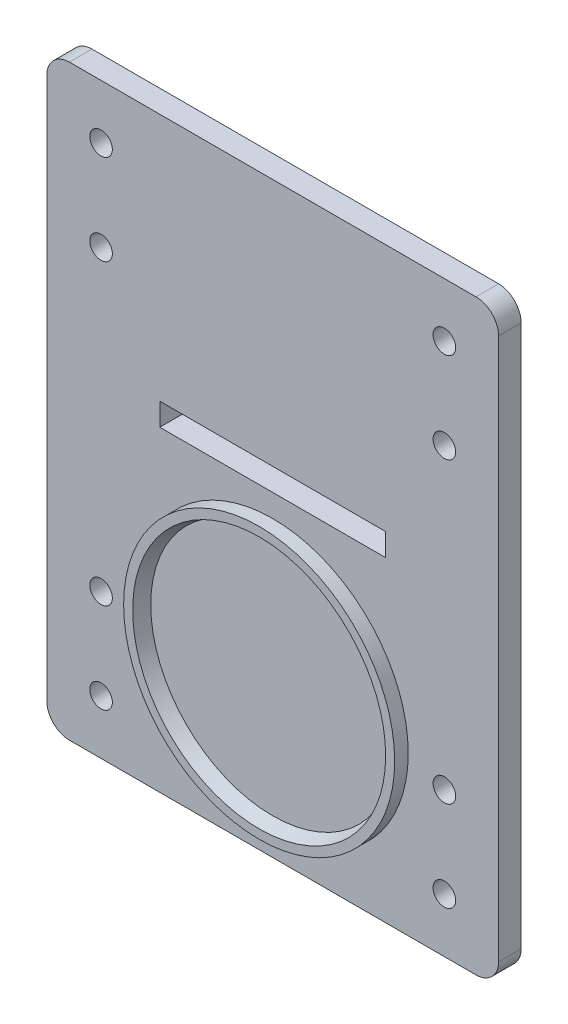
ISO-10303-21;
HEADER;
FILE_DESCRIPTION(('STEP AP214'),'2;1');
FILE_NAME('part.step','',(''),(''),'','','');
FILE_SCHEMA(('AUTOMOTIVE_DESIGN { 1 0 10303 214 1 1 1 1 }'));
ENDSEC;
DATA;
#1=APPLICATION_CONTEXT('core data for automotive mechanical design processes');
#2=APPLICATION_PROTOCOL_DEFINITION('international standard','automotive_design',2000,#1);
#3=PRODUCT_CONTEXT('',#1,'mechanical');
#4=PRODUCT('Part','Part','',(#3));
#5=PRODUCT_RELATED_PRODUCT_CATEGORY('part','',(#4));
#6=PRODUCT_DEFINITION_FORMATION('','',#4);
#7=PRODUCT_DEFINITION_CONTEXT('part definition',#1,'design');
#8=PRODUCT_DEFINITION('design','',#6,#7);
#9=PRODUCT_DEFINITION_SHAPE('','',#8);
#10=(LENGTH_UNIT() NAMED_UNIT(*) SI_UNIT(.MILLI.,.METRE.));
#11=(NAMED_UNIT(*) PLANE_ANGLE_UNIT() SI_UNIT($,.RADIAN.));
#12=(NAMED_UNIT(*) SI_UNIT($,.STERADIAN.) SOLID_ANGLE_UNIT());
#13=UNCERTAINTY_MEASURE_WITH_UNIT(LENGTH_MEASURE(1.E-05),#10,'distance_accuracy_value','');
#14=(GEOMETRIC_REPRESENTATION_CONTEXT(3) GLOBAL_UNCERTAINTY_ASSIGNED_CONTEXT((#13)) GLOBAL_UNIT_ASSIGNED_CONTEXT((#10,
#11,#12)) REPRESENTATION_CONTEXT('',''));
#15=CARTESIAN_POINT('',(0.,0.,0.));
#16=DIRECTION('',(0.,0.,1.));
#17=DIRECTION('',(1.,0.,0.));
#18=AXIS2_PLACEMENT_3D('',#15,#16,#17);
#19=CARTESIAN_POINT('',(50.,-65.,5.));
#20=DIRECTION('',(-1.,0.,0.));
#21=DIRECTION('',(0.,0.,1.));
#22=AXIS2_PLACEMENT_3D('',#19,#20,#21);
#23=PLANE('',#22);
#24=DIRECTION('',(0.,1.,0.));
#25=VECTOR('',#24,1.);
#26=CARTESIAN_POINT('',(50.,-65.,5.));
#27=LINE('',#26,#25);
#28=CARTESIAN_POINT('',(50.,-60.,5.));
#29=VERTEX_POINT('',#28);
#30=CARTESIAN_POINT('',(50.,60.,5.));
#31=VERTEX_POINT('',#30);
#32=EDGE_CURVE('E223',#29,#31,#27,.T.);
#33=ORIENTED_EDGE('',*,*,#32,.F.);
#34=DIRECTION('',(0.,0.,-1.));
#35=VECTOR('',#34,1.);
#36=CARTESIAN_POINT('',(50.,-60.,5.));
#37=LINE('',#36,#35);
#38=CARTESIAN_POINT('',(50.,-60.,0.));
#39=VERTEX_POINT('',#38);
#40=EDGE_CURVE('E276',#29,#39,#37,.T.);
#41=ORIENTED_EDGE('',*,*,#40,.T.);
#42=DIRECTION('',(0.,1.,0.));
#43=VECTOR('',#42,1.);
#44=CARTESIAN_POINT('',(50.,-65.,0.));
#45=LINE('',#44,#43);
#46=CARTESIAN_POINT('',(50.,60.,0.));
#47=VERTEX_POINT('',#46);
#48=EDGE_CURVE('E222',#39,#47,#45,.T.);
#49=ORIENTED_EDGE('',*,*,#48,.T.);
#50=DIRECTION('',(0.,0.,-1.));
#51=VECTOR('',#50,1.);
#52=CARTESIAN_POINT('',(50.,60.,5.));
#53=LINE('',#52,#51);
#54=EDGE_CURVE('E274',#47,#31,#53,.F.);
#55=ORIENTED_EDGE('',*,*,#54,.T.);
#56=EDGE_LOOP('',(#33,#41,#49,#55));
#57=FACE_BOUND('',#56,.T.);
#58=ADVANCED_FACE('F35',(#57),#23,.F.);
#59=CARTESIAN_POINT('',(-50.,65.,5.));
#60=DIRECTION('',(0.,-1.,0.));
#61=DIRECTION('',(0.,0.,-1.));
#62=AXIS2_PLACEMENT_3D('',#59,#60,#61);
#63=PLANE('',#62);
#64=DIRECTION('',(-1.,0.,0.));
#65=VECTOR('',#64,1.);
#66=CARTESIAN_POINT('',(-50.,65.,5.));
#67=LINE('',#66,#65);
#68=CARTESIAN_POINT('',(45.,65.,5.));
#69=VERTEX_POINT('',#68);
#70=CARTESIAN_POINT('',(-45.,65.,5.));
#71=VERTEX_POINT('',#70);
#72=EDGE_CURVE('E225',#69,#71,#67,.T.);
#73=ORIENTED_EDGE('',*,*,#72,.F.);
#74=DIRECTION('',(0.,0.,-1.));
#75=VECTOR('',#74,1.);
#76=CARTESIAN_POINT('',(45.,65.,5.));
#77=LINE('',#76,#75);
#78=CARTESIAN_POINT('',(45.,65.,0.));
#79=VERTEX_POINT('',#78);
#80=EDGE_CURVE('E11',#69,#79,#77,.T.);
#81=ORIENTED_EDGE('',*,*,#80,.T.);
#82=DIRECTION('',(-1.,0.,0.));
#83=VECTOR('',#82,1.);
#84=CARTESIAN_POINT('',(-50.,65.,0.));
#85=LINE('',#84,#83);
#86=CARTESIAN_POINT('',(-45.,65.,0.));
#87=VERTEX_POINT('',#86);
#88=EDGE_CURVE('E237',#79,#87,#85,.T.);
#89=ORIENTED_EDGE('',*,*,#88,.T.);
#90=DIRECTION('',(0.,0.,-1.));
#91=VECTOR('',#90,1.);
#92=CARTESIAN_POINT('',(-45.,65.,5.));
#93=LINE('',#92,#91);
#94=EDGE_CURVE('E43',#87,#71,#93,.F.);
#95=ORIENTED_EDGE('',*,*,#94,.T.);
#96=EDGE_LOOP('',(#73,#81,#89,#95));
#97=FACE_BOUND('',#96,.T.);
#98=ADVANCED_FACE('F291',(#97),#63,.F.);
#99=CARTESIAN_POINT('',(-50.,-65.,5.));
#100=DIRECTION('',(1.,0.,0.));
#101=DIRECTION('',(0.,0.,-1.));
#102=AXIS2_PLACEMENT_3D('',#99,#100,#101);
#103=PLANE('',#102);
#104=DIRECTION('',(0.,-1.,0.));
#105=VECTOR('',#104,1.);
#106=CARTESIAN_POINT('',(-50.,-65.,0.));
#107=LINE('',#106,#105);
#108=CARTESIAN_POINT('',(-50.,60.,0.));
#109=VERTEX_POINT('',#108);
#110=CARTESIAN_POINT('',(-50.,-60.,0.));
#111=VERTEX_POINT('',#110);
#112=EDGE_CURVE('E239',#109,#111,#107,.T.);
#113=ORIENTED_EDGE('',*,*,#112,.T.);
#114=DIRECTION('',(0.,0.,-1.));
#115=VECTOR('',#114,1.);
#116=CARTESIAN_POINT('',(-50.,-60.,5.));
#117=LINE('',#116,#115);
#118=CARTESIAN_POINT('',(-50.,-60.,5.));
#119=VERTEX_POINT('',#118);
#120=EDGE_CURVE('E265',#111,#119,#117,.F.);
#121=ORIENTED_EDGE('',*,*,#120,.T.);
#122=DIRECTION('',(0.,-1.,0.));
#123=VECTOR('',#122,1.);
#124=CARTESIAN_POINT('',(-50.,-65.,5.));
#125=LINE('',#124,#123);
#126=CARTESIAN_POINT('',(-50.,60.,5.));
#127=VERTEX_POINT('',#126);
#128=EDGE_CURVE('E228',#127,#119,#125,.T.);
#129=ORIENTED_EDGE('',*,*,#128,.F.);
#130=DIRECTION('',(0.,0.,-1.));
#131=VECTOR('',#130,1.);
#132=CARTESIAN_POINT('',(-50.,60.,5.));
#133=LINE('',#132,#131);
#134=EDGE_CURVE('E262',#127,#109,#133,.T.);
#135=ORIENTED_EDGE('',*,*,#134,.T.);
#136=EDGE_LOOP('',(#113,#121,#129,#135));
#137=FACE_BOUND('',#136,.T.);
#138=ADVANCED_FACE('F299',(#137),#103,.F.);
#139=CARTESIAN_POINT('',(-50.,-65.,5.));
#140=DIRECTION('',(0.,1.,0.));
#141=DIRECTION('',(0.,0.,1.));
#142=AXIS2_PLACEMENT_3D('',#139,#140,#141);
#143=PLANE('',#142);
#144=DIRECTION('',(1.,0.,0.));
#145=VECTOR('',#144,1.);
#146=CARTESIAN_POINT('',(-50.,-65.,5.));
#147=LINE('',#146,#145);
#148=CARTESIAN_POINT('',(-45.,-65.,5.));
#149=VERTEX_POINT('',#148);
#150=CARTESIAN_POINT('',(45.,-65.,5.));
#151=VERTEX_POINT('',#150);
#152=EDGE_CURVE('E231',#149,#151,#147,.T.);
#153=ORIENTED_EDGE('',*,*,#152,.F.);
#154=DIRECTION('',(0.,0.,-1.));
#155=VECTOR('',#154,1.);
#156=CARTESIAN_POINT('',(-45.,-65.,5.));
#157=LINE('',#156,#155);
#158=CARTESIAN_POINT('',(-45.,-65.,0.));
#159=VERTEX_POINT('',#158);
#160=EDGE_CURVE('E251',#149,#159,#157,.T.);
#161=ORIENTED_EDGE('',*,*,#160,.T.);
#162=DIRECTION('',(1.,0.,0.));
#163=VECTOR('',#162,1.);
#164=CARTESIAN_POINT('',(-50.,-65.,0.));
#165=LINE('',#164,#163);
#166=CARTESIAN_POINT('',(45.,-65.,0.));
#167=VERTEX_POINT('',#166);
#168=EDGE_CURVE('E226',#159,#167,#165,.T.);
#169=ORIENTED_EDGE('',*,*,#168,.T.);
#170=DIRECTION('',(0.,0.,-1.));
#171=VECTOR('',#170,1.);
#172=CARTESIAN_POINT('',(45.,-65.,5.));
#173=LINE('',#172,#171);
#174=EDGE_CURVE('E249',#167,#151,#173,.F.);
#175=ORIENTED_EDGE('',*,*,#174,.T.);
#176=EDGE_LOOP('',(#153,#161,#169,#175));
#177=FACE_BOUND('',#176,.T.);
#178=ADVANCED_FACE('F307',(#177),#143,.F.);
#179=CARTESIAN_POINT('',(0.,0.,5.));
#180=DIRECTION('',(0.,0.,-1.));
#181=DIRECTION('',(-1.,0.,0.));
#182=AXIS2_PLACEMENT_3D('',#179,#180,#181);
#183=PLANE('',#182);
#184=CARTESIAN_POINT('',(-38.,-33.,5.));
#185=DIRECTION('',(0.,0.,1.));
#186=DIRECTION('',(1.,0.,0.));
#187=AXIS2_PLACEMENT_3D('',#184,#185,#186);
#188=CIRCLE('',#187,2.5);
#189=CARTESIAN_POINT('',(-35.5,-33.,5.));
#190=VERTEX_POINT('',#189);
#191=EDGE_CURVE('E191',#190,#190,#188,.T.);
#192=ORIENTED_EDGE('',*,*,#191,.F.);
#193=EDGE_LOOP('',(#192));
#194=FACE_BOUND('',#193,.T.);
#195=CARTESIAN_POINT('',(38.,-53.,5.));
#196=DIRECTION('',(0.,0.,1.));
#197=DIRECTION('',(1.,0.,0.));
#198=AXIS2_PLACEMENT_3D('',#195,#196,#197);
#199=CIRCLE('',#198,2.5);
#200=CARTESIAN_POINT('',(40.5,-53.,5.));
#201=VERTEX_POINT('',#200);
#202=EDGE_CURVE('E197',#201,#201,#199,.T.);
#203=ORIENTED_EDGE('',*,*,#202,.F.);
#204=EDGE_LOOP('',(#203));
#205=FACE_BOUND('',#204,.T.);
#206=CARTESIAN_POINT('',(37.9999999999996,53.,5.));
#207=DIRECTION('',(0.,0.,1.));
#208=DIRECTION('',(1.,0.,0.));
#209=AXIS2_PLACEMENT_3D('',#206,#207,#208);
#210=CIRCLE('',#209,2.5);
#211=CARTESIAN_POINT('',(40.4999999999996,53.,5.));
#212=VERTEX_POINT('',#211);
#213=EDGE_CURVE('E203',#212,#212,#210,.T.);
#214=ORIENTED_EDGE('',*,*,#213,.F.);
#215=EDGE_LOOP('',(#214));
#216=FACE_BOUND('',#215,.T.);
#217=CARTESIAN_POINT('',(-38.0000000000004,53.,5.));
#218=DIRECTION('',(0.,0.,1.));
#219=DIRECTION('',(1.,0.,0.));
#220=AXIS2_PLACEMENT_3D('',#217,#218,#219);
#221=CIRCLE('',#220,2.5);
#222=CARTESIAN_POINT('',(-35.5000000000004,53.,5.));
#223=VERTEX_POINT('',#222);
#224=EDGE_CURVE('E166',#223,#223,#221,.T.);
#225=ORIENTED_EDGE('',*,*,#224,.F.);
#226=EDGE_LOOP('',(#225));
#227=FACE_BOUND('',#226,.T.);
#228=DIRECTION('',(-1.,0.,0.));
#229=VECTOR('',#228,1.);
#230=CARTESIAN_POINT('',(-25.,10.,5.));
#231=LINE('',#230,#229);
#232=CARTESIAN_POINT('',(25.,10.,5.));
#233=VERTEX_POINT('',#232);
#234=CARTESIAN_POINT('',(-25.,10.,5.));
#235=VERTEX_POINT('',#234);
#236=EDGE_CURVE('E159',#233,#235,#231,.T.);
#237=ORIENTED_EDGE('',*,*,#236,.F.);
#238=DIRECTION('',(0.,1.,0.));
#239=VECTOR('',#238,1.);
#240=CARTESIAN_POINT('',(25.,5.00000000000002,5.));
#241=LINE('',#240,#239);
#242=CARTESIAN_POINT('',(25.,5.00000000000002,5.));
#243=VERTEX_POINT('',#242);
#244=EDGE_CURVE('E132',#243,#233,#241,.T.);
#245=ORIENTED_EDGE('',*,*,#244,.F.);
#246=DIRECTION('',(1.,0.,0.));
#247=VECTOR('',#246,1.);
#248=CARTESIAN_POINT('',(-25.,5.00000000000002,5.));
#249=LINE('',#248,#247);
#250=CARTESIAN_POINT('',(-25.,5.00000000000002,5.));
#251=VERTEX_POINT('',#250);
#252=EDGE_CURVE('E150',#251,#243,#249,.T.);
#253=ORIENTED_EDGE('',*,*,#252,.F.);
#254=DIRECTION('',(0.,-1.,0.));
#255=VECTOR('',#254,1.);
#256=CARTESIAN_POINT('',(-25.,5.00000000000002,5.));
#257=LINE('',#256,#255);
#258=EDGE_CURVE('E153',#235,#251,#257,.T.);
#259=ORIENTED_EDGE('',*,*,#258,.F.);
#260=EDGE_LOOP('',(#237,#245,#253,#259));
#261=FACE_BOUND('',#260,.T.);
#262=CARTESIAN_POINT('',(38.,-33.,5.));
#263=DIRECTION('',(0.,0.,1.));
#264=DIRECTION('',(1.,0.,0.));
#265=AXIS2_PLACEMENT_3D('',#262,#263,#264);
#266=CIRCLE('',#265,2.5);
#267=CARTESIAN_POINT('',(40.5,-33.,5.));
#268=VERTEX_POINT('',#267);
#269=EDGE_CURVE('E172',#268,#268,#266,.T.);
#270=ORIENTED_EDGE('',*,*,#269,.F.);
#271=EDGE_LOOP('',(#270));
#272=FACE_BOUND('',#271,.T.);
#273=CARTESIAN_POINT('',(37.9999999999998,33.,5.));
#274=DIRECTION('',(0.,0.,1.));
#275=DIRECTION('',(1.,0.,0.));
#276=AXIS2_PLACEMENT_3D('',#273,#274,#275);
#277=CIRCLE('',#276,2.5);
#278=CARTESIAN_POINT('',(40.4999999999998,33.,5.));
#279=VERTEX_POINT('',#278);
#280=EDGE_CURVE('E178',#279,#279,#277,.T.);
#281=ORIENTED_EDGE('',*,*,#280,.F.);
#282=EDGE_LOOP('',(#281));
#283=FACE_BOUND('',#282,.T.);
#284=CARTESIAN_POINT('',(-38.0000000000002,33.,5.));
#285=DIRECTION('',(0.,0.,1.));
#286=DIRECTION('',(1.,0.,0.));
#287=AXIS2_PLACEMENT_3D('',#284,#285,#286);
#288=CIRCLE('',#287,2.5);
#289=CARTESIAN_POINT('',(-35.5000000000002,33.,5.));
#290=VERTEX_POINT('',#289);
#291=EDGE_CURVE('E184',#290,#290,#288,.T.);
#292=ORIENTED_EDGE('',*,*,#291,.F.);
#293=EDGE_LOOP('',(#292));
#294=FACE_BOUND('',#293,.T.);
#295=CARTESIAN_POINT('',(-38.,-53.,5.));
#296=DIRECTION('',(0.,0.,1.));
#297=DIRECTION('',(1.,0.,0.));
#298=AXIS2_PLACEMENT_3D('',#295,#296,#297);
#299=CIRCLE('',#298,2.5);
#300=CARTESIAN_POINT('',(-35.5,-53.,5.));
#301=VERTEX_POINT('',#300);
#302=EDGE_CURVE('E190',#301,#301,#299,.T.);
#303=ORIENTED_EDGE('',*,*,#302,.F.);
#304=EDGE_LOOP('',(#303));
#305=FACE_BOUND('',#304,.T.);
#306=CARTESIAN_POINT('',(0.,-30.,5.));
#307=DIRECTION('',(0.,0.,-1.));
#308=DIRECTION('',(-1.,0.,0.));
#309=AXIS2_PLACEMENT_3D('',#306,#307,#308);
#310=CIRCLE('',#309,30.);
#311=CARTESIAN_POINT('',(-30.,-30.,5.));
#312=VERTEX_POINT('',#311);
#313=EDGE_CURVE('E234',#312,#312,#310,.F.);
#314=ORIENTED_EDGE('',*,*,#313,.F.);
#315=EDGE_LOOP('',(#314));
#316=FACE_BOUND('',#315,.T.);
#317=ORIENTED_EDGE('',*,*,#128,.T.);
#318=CARTESIAN_POINT('',(-45.,-60.,5.));
#319=DIRECTION('',(0.,0.,-1.));
#320=DIRECTION('',(-1.,0.,0.));
#321=AXIS2_PLACEMENT_3D('',#318,#319,#320);
#322=CIRCLE('',#321,5.);
#323=EDGE_CURVE('E272',#119,#149,#322,.F.);
#324=ORIENTED_EDGE('',*,*,#323,.T.);
#325=ORIENTED_EDGE('',*,*,#152,.T.);
#326=CARTESIAN_POINT('',(45.,-60.,5.));
#327=DIRECTION('',(0.,0.,-1.));
#328=DIRECTION('',(-1.,0.,0.));
#329=AXIS2_PLACEMENT_3D('',#326,#327,#328);
#330=CIRCLE('',#329,5.);
#331=EDGE_CURVE('E270',#151,#29,#330,.F.);
#332=ORIENTED_EDGE('',*,*,#331,.T.);
#333=ORIENTED_EDGE('',*,*,#32,.T.);
#334=CARTESIAN_POINT('',(45.,60.,5.));
#335=DIRECTION('',(0.,0.,-1.));
#336=DIRECTION('',(-1.,0.,0.));
#337=AXIS2_PLACEMENT_3D('',#334,#335,#336);
#338=CIRCLE('',#337,5.);
#339=EDGE_CURVE('E56',#31,#69,#338,.F.);
#340=ORIENTED_EDGE('',*,*,#339,.T.);
#341=ORIENTED_EDGE('',*,*,#72,.T.);
#342=CARTESIAN_POINT('',(-45.,60.,5.));
#343=DIRECTION('',(0.,0.,-1.));
#344=DIRECTION('',(-1.,0.,0.));
#345=AXIS2_PLACEMENT_3D('',#342,#343,#344);
#346=CIRCLE('',#345,5.);
#347=EDGE_CURVE('E267',#71,#127,#346,.F.);
#348=ORIENTED_EDGE('',*,*,#347,.T.);
#349=EDGE_LOOP('',(#317,#324,#325,#332,#333,#340,#341,#348));
#350=FACE_BOUND('',#349,.T.);
#351=ADVANCED_FACE('F293',(#194,#205,#216,#227,#261,#272,#283,#294,#305,#316,#350),#183,.F.);
#352=CARTESIAN_POINT('',(0.,0.,0.));
#353=DIRECTION('',(0.,0.,-1.));
#354=DIRECTION('',(-1.,0.,0.));
#355=AXIS2_PLACEMENT_3D('',#352,#353,#354);
#356=PLANE('',#355);
#357=CARTESIAN_POINT('',(-38.,-33.,0.));
#358=DIRECTION('',(0.,0.,1.));
#359=DIRECTION('',(1.,0.,0.));
#360=AXIS2_PLACEMENT_3D('',#357,#358,#359);
#361=CIRCLE('',#360,2.5);
#362=CARTESIAN_POINT('',(-35.5,-33.,0.));
#363=VERTEX_POINT('',#362);
#364=EDGE_CURVE('E187',#363,#363,#361,.T.);
#365=ORIENTED_EDGE('',*,*,#364,.T.);
#366=EDGE_LOOP('',(#365));
#367=FACE_BOUND('',#366,.T.);
#368=CARTESIAN_POINT('',(38.,-53.,0.));
#369=DIRECTION('',(0.,0.,1.));
#370=DIRECTION('',(1.,0.,0.));
#371=AXIS2_PLACEMENT_3D('',#368,#369,#370);
#372=CIRCLE('',#371,2.5);
#373=CARTESIAN_POINT('',(40.5,-53.,0.));
#374=VERTEX_POINT('',#373);
#375=EDGE_CURVE('E194',#374,#374,#372,.T.);
#376=ORIENTED_EDGE('',*,*,#375,.T.);
#377=EDGE_LOOP('',(#376));
#378=FACE_BOUND('',#377,.T.);
#379=CARTESIAN_POINT('',(37.9999999999996,53.,0.));
#380=DIRECTION('',(0.,0.,1.));
#381=DIRECTION('',(1.,0.,0.));
#382=AXIS2_PLACEMENT_3D('',#379,#380,#381);
#383=CIRCLE('',#382,2.5);
#384=CARTESIAN_POINT('',(40.4999999999996,53.,0.));
#385=VERTEX_POINT('',#384);
#386=EDGE_CURVE('E200',#385,#385,#383,.T.);
#387=ORIENTED_EDGE('',*,*,#386,.T.);
#388=EDGE_LOOP('',(#387));
#389=FACE_BOUND('',#388,.T.);
#390=CARTESIAN_POINT('',(-38.0000000000004,53.,0.));
#391=DIRECTION('',(0.,0.,1.));
#392=DIRECTION('',(1.,0.,0.));
#393=AXIS2_PLACEMENT_3D('',#390,#391,#392);
#394=CIRCLE('',#393,2.5);
#395=CARTESIAN_POINT('',(-35.5000000000004,53.,0.));
#396=VERTEX_POINT('',#395);
#397=EDGE_CURVE('E206',#396,#396,#394,.T.);
#398=ORIENTED_EDGE('',*,*,#397,.T.);
#399=EDGE_LOOP('',(#398));
#400=FACE_BOUND('',#399,.T.);
#401=DIRECTION('',(0.,1.,0.));
#402=VECTOR('',#401,1.);
#403=CARTESIAN_POINT('',(25.,5.00000000000002,0.));
#404=LINE('',#403,#402);
#405=CARTESIAN_POINT('',(25.,5.00000000000002,0.));
#406=VERTEX_POINT('',#405);
#407=CARTESIAN_POINT('',(25.,10.,0.));
#408=VERTEX_POINT('',#407);
#409=EDGE_CURVE('E129',#406,#408,#404,.T.);
#410=ORIENTED_EDGE('',*,*,#409,.T.);
#411=DIRECTION('',(-1.,0.,0.));
#412=VECTOR('',#411,1.);
#413=CARTESIAN_POINT('',(-25.,10.,0.));
#414=LINE('',#413,#412);
#415=CARTESIAN_POINT('',(-25.,10.,0.));
#416=VERTEX_POINT('',#415);
#417=EDGE_CURVE('E141',#408,#416,#414,.T.);
#418=ORIENTED_EDGE('',*,*,#417,.T.);
#419=DIRECTION('',(0.,-1.,0.));
#420=VECTOR('',#419,1.);
#421=CARTESIAN_POINT('',(-25.,5.00000000000002,0.));
#422=LINE('',#421,#420);
#423=CARTESIAN_POINT('',(-25.,5.00000000000002,0.));
#424=VERTEX_POINT('',#423);
#425=EDGE_CURVE('E145',#416,#424,#422,.T.);
#426=ORIENTED_EDGE('',*,*,#425,.T.);
#427=DIRECTION('',(1.,0.,0.));
#428=VECTOR('',#427,1.);
#429=CARTESIAN_POINT('',(-25.,5.00000000000002,0.));
#430=LINE('',#429,#428);
#431=EDGE_CURVE('E137',#424,#406,#430,.T.);
#432=ORIENTED_EDGE('',*,*,#431,.T.);
#433=EDGE_LOOP('',(#410,#418,#426,#432));
#434=FACE_BOUND('',#433,.T.);
#435=CARTESIAN_POINT('',(38.,-33.,0.));
#436=DIRECTION('',(0.,0.,1.));
#437=DIRECTION('',(1.,0.,0.));
#438=AXIS2_PLACEMENT_3D('',#435,#436,#437);
#439=CIRCLE('',#438,2.5);
#440=CARTESIAN_POINT('',(40.5,-33.,0.));
#441=VERTEX_POINT('',#440);
#442=EDGE_CURVE('E160',#441,#441,#439,.T.);
#443=ORIENTED_EDGE('',*,*,#442,.T.);
#444=EDGE_LOOP('',(#443));
#445=FACE_BOUND('',#444,.T.);
#446=CARTESIAN_POINT('',(37.9999999999998,33.,0.));
#447=DIRECTION('',(0.,0.,1.));
#448=DIRECTION('',(1.,0.,0.));
#449=AXIS2_PLACEMENT_3D('',#446,#447,#448);
#450=CIRCLE('',#449,2.5);
#451=CARTESIAN_POINT('',(40.4999999999998,33.,0.));
#452=VERTEX_POINT('',#451);
#453=EDGE_CURVE('E175',#452,#452,#450,.T.);
#454=ORIENTED_EDGE('',*,*,#453,.T.);
#455=EDGE_LOOP('',(#454));
#456=FACE_BOUND('',#455,.T.);
#457=CARTESIAN_POINT('',(-38.0000000000002,33.,0.));
#458=DIRECTION('',(0.,0.,1.));
#459=DIRECTION('',(1.,0.,0.));
#460=AXIS2_PLACEMENT_3D('',#457,#458,#459);
#461=CIRCLE('',#460,2.5);
#462=CARTESIAN_POINT('',(-35.5000000000002,33.,0.));
#463=VERTEX_POINT('',#462);
#464=EDGE_CURVE('E181',#463,#463,#461,.T.);
#465=ORIENTED_EDGE('',*,*,#464,.T.);
#466=EDGE_LOOP('',(#465));
#467=FACE_BOUND('',#466,.T.);
#468=CARTESIAN_POINT('',(-38.,-53.,0.));
#469=DIRECTION('',(0.,0.,1.));
#470=DIRECTION('',(1.,0.,0.));
#471=AXIS2_PLACEMENT_3D('',#468,#469,#470);
#472=CIRCLE('',#471,2.5);
#473=CARTESIAN_POINT('',(-35.5,-53.,0.));
#474=VERTEX_POINT('',#473);
#475=EDGE_CURVE('E211',#474,#474,#472,.T.);
#476=ORIENTED_EDGE('',*,*,#475,.T.);
#477=EDGE_LOOP('',(#476));
#478=FACE_BOUND('',#477,.T.);
#479=ORIENTED_EDGE('',*,*,#168,.F.);
#480=CARTESIAN_POINT('',(-45.,-60.,0.));
#481=DIRECTION('',(0.,0.,-1.));
#482=DIRECTION('',(-1.,0.,0.));
#483=AXIS2_PLACEMENT_3D('',#480,#481,#482);
#484=CIRCLE('',#483,5.);
#485=EDGE_CURVE('E260',#159,#111,#484,.T.);
#486=ORIENTED_EDGE('',*,*,#485,.T.);
#487=ORIENTED_EDGE('',*,*,#112,.F.);
#488=CARTESIAN_POINT('',(-45.,60.,0.));
#489=DIRECTION('',(0.,0.,-1.));
#490=DIRECTION('',(-1.,0.,0.));
#491=AXIS2_PLACEMENT_3D('',#488,#489,#490);
#492=CIRCLE('',#491,5.);
#493=EDGE_CURVE('E254',#109,#87,#492,.T.);
#494=ORIENTED_EDGE('',*,*,#493,.T.);
#495=ORIENTED_EDGE('',*,*,#88,.F.);
#496=CARTESIAN_POINT('',(45.,60.,0.));
#497=DIRECTION('',(0.,0.,-1.));
#498=DIRECTION('',(-1.,0.,0.));
#499=AXIS2_PLACEMENT_3D('',#496,#497,#498);
#500=CIRCLE('',#499,5.);
#501=EDGE_CURVE('E256',#79,#47,#500,.T.);
#502=ORIENTED_EDGE('',*,*,#501,.T.);
#503=ORIENTED_EDGE('',*,*,#48,.F.);
#504=CARTESIAN_POINT('',(45.,-60.,0.));
#505=DIRECTION('',(0.,0.,-1.));
#506=DIRECTION('',(-1.,0.,0.));
#507=AXIS2_PLACEMENT_3D('',#504,#505,#506);
#508=CIRCLE('',#507,5.);
#509=EDGE_CURVE('E258',#39,#167,#508,.T.);
#510=ORIENTED_EDGE('',*,*,#509,.T.);
#511=EDGE_LOOP('',(#479,#486,#487,#494,#495,#502,#503,#510));
#512=FACE_BOUND('',#511,.T.);
#513=ADVANCED_FACE('F147',(#367,#378,#389,#400,#434,#445,#456,#467,#478,#512),#356,.T.);
#514=CARTESIAN_POINT('',(0.,-30.,8.));
#515=DIRECTION('',(0.,0.,1.));
#516=DIRECTION('',(1.,0.,0.));
#517=AXIS2_PLACEMENT_3D('',#514,#515,#516);
#518=PLANE('',#517);
#519=CARTESIAN_POINT('',(0.,-30.,8.));
#520=DIRECTION('',(0.,0.,1.));
#521=DIRECTION('',(1.,0.,0.));
#522=AXIS2_PLACEMENT_3D('',#519,#520,#521);
#523=CIRCLE('',#522,28.);
#524=CARTESIAN_POINT('',(28.,-30.,8.));
#525=VERTEX_POINT('',#524);
#526=EDGE_CURVE('E246',#525,#525,#523,.F.);
#527=ORIENTED_EDGE('',*,*,#526,.T.);
#528=EDGE_LOOP('',(#527));
#529=FACE_BOUND('',#528,.T.);
#530=CARTESIAN_POINT('',(0.,-30.,8.));
#531=DIRECTION('',(0.,0.,1.));
#532=DIRECTION('',(1.,0.,0.));
#533=AXIS2_PLACEMENT_3D('',#530,#531,#532);
#534=CIRCLE('',#533,30.);
#535=CARTESIAN_POINT('',(30.,-30.,8.));
#536=VERTEX_POINT('',#535);
#537=EDGE_CURVE('E219',#536,#536,#534,.T.);
#538=ORIENTED_EDGE('',*,*,#537,.T.);
#539=EDGE_LOOP('',(#538));
#540=FACE_BOUND('',#539,.T.);
#541=ADVANCED_FACE('F354',(#529,#540),#518,.T.);
#542=CARTESIAN_POINT('',(0.,-30.,8.));
#543=DIRECTION('',(0.,0.,-1.));
#544=DIRECTION('',(-1.,0.,0.));
#545=AXIS2_PLACEMENT_3D('',#542,#543,#544);
#546=CYLINDRICAL_SURFACE('',#545,30.);
#547=ORIENTED_EDGE('',*,*,#537,.F.);
#548=EDGE_LOOP('',(#547));
#549=FACE_BOUND('',#548,.T.);
#550=ORIENTED_EDGE('',*,*,#313,.T.);
#551=EDGE_LOOP('',(#550));
#552=FACE_BOUND('',#551,.T.);
#553=ADVANCED_FACE('F345',(#549,#552),#546,.T.);
#554=CARTESIAN_POINT('',(0.,-30.,5.));
#555=DIRECTION('',(0.,0.,1.));
#556=DIRECTION('',(1.,0.,0.));
#557=AXIS2_PLACEMENT_3D('',#554,#555,#556);
#558=CIRCLE('',#557,27.);
#559=CARTESIAN_POINT('',(27.,-30.,5.));
#560=VERTEX_POINT('',#559);
#561=EDGE_CURVE('E214',#560,#560,#558,.T.);
#562=ORIENTED_EDGE('',*,*,#561,.T.);
#563=EDGE_LOOP('',(#562));
#564=FACE_BOUND('',#563,.T.);
#565=ADVANCED_FACE('F342',(#564),#183,.F.);
#566=CARTESIAN_POINT('',(-38.,-53.,0.));
#567=DIRECTION('',(0.,0.,1.));
#568=DIRECTION('',(1.,0.,0.));
#569=AXIS2_PLACEMENT_3D('',#566,#567,#568);
#570=CYLINDRICAL_SURFACE('',#569,2.5);
#571=ORIENTED_EDGE('',*,*,#475,.F.);
#572=EDGE_LOOP('',(#571));
#573=FACE_BOUND('',#572,.T.);
#574=ORIENTED_EDGE('',*,*,#302,.T.);
#575=EDGE_LOOP('',(#574));
#576=FACE_BOUND('',#575,.T.);
#577=ADVANCED_FACE('F344',(#573,#576),#570,.F.);
#578=CARTESIAN_POINT('',(-38.0000000000002,33.,0.));
#579=DIRECTION('',(0.,0.,1.));
#580=DIRECTION('',(1.,0.,0.));
#581=AXIS2_PLACEMENT_3D('',#578,#579,#580);
#582=CYLINDRICAL_SURFACE('',#581,2.5);
#583=ORIENTED_EDGE('',*,*,#464,.F.);
#584=EDGE_LOOP('',(#583));
#585=FACE_BOUND('',#584,.T.);
#586=ORIENTED_EDGE('',*,*,#291,.T.);
#587=EDGE_LOOP('',(#586));
#588=FACE_BOUND('',#587,.T.);
#589=ADVANCED_FACE('F351',(#585,#588),#582,.F.);
#590=CARTESIAN_POINT('',(37.9999999999998,33.,0.));
#591=DIRECTION('',(0.,0.,1.));
#592=DIRECTION('',(1.,0.,0.));
#593=AXIS2_PLACEMENT_3D('',#590,#591,#592);
#594=CYLINDRICAL_SURFACE('',#593,2.5);
#595=ORIENTED_EDGE('',*,*,#453,.F.);
#596=EDGE_LOOP('',(#595));
#597=FACE_BOUND('',#596,.T.);
#598=ORIENTED_EDGE('',*,*,#280,.T.);
#599=EDGE_LOOP('',(#598));
#600=FACE_BOUND('',#599,.T.);
#601=ADVANCED_FACE('F389',(#597,#600),#594,.F.);
#602=CARTESIAN_POINT('',(38.,-33.,0.));
#603=DIRECTION('',(0.,0.,1.));
#604=DIRECTION('',(1.,0.,0.));
#605=AXIS2_PLACEMENT_3D('',#602,#603,#604);
#606=CYLINDRICAL_SURFACE('',#605,2.5);
#607=ORIENTED_EDGE('',*,*,#442,.F.);
#608=EDGE_LOOP('',(#607));
#609=FACE_BOUND('',#608,.T.);
#610=ORIENTED_EDGE('',*,*,#269,.T.);
#611=EDGE_LOOP('',(#610));
#612=FACE_BOUND('',#611,.T.);
#613=ADVANCED_FACE('F395',(#609,#612),#606,.F.);
#614=CARTESIAN_POINT('',(25.,5.00000000000002,0.));
#615=DIRECTION('',(1.,0.,0.));
#616=DIRECTION('',(0.,0.,-1.));
#617=AXIS2_PLACEMENT_3D('',#614,#615,#616);
#618=PLANE('',#617);
#619=ORIENTED_EDGE('',*,*,#244,.T.);
#620=DIRECTION('',(0.,0.,1.));
#621=VECTOR('',#620,1.);
#622=CARTESIAN_POINT('',(25.,10.,0.));
#623=LINE('',#622,#621);
#624=EDGE_CURVE('E125',#408,#233,#623,.T.);
#625=ORIENTED_EDGE('',*,*,#624,.F.);
#626=ORIENTED_EDGE('',*,*,#409,.F.);
#627=DIRECTION('',(0.,0.,1.));
#628=VECTOR('',#627,1.);
#629=CARTESIAN_POINT('',(25.,5.00000000000002,0.));
#630=LINE('',#629,#628);
#631=EDGE_CURVE('E164',#406,#243,#630,.T.);
#632=ORIENTED_EDGE('',*,*,#631,.T.);
#633=EDGE_LOOP('',(#619,#625,#626,#632));
#634=FACE_BOUND('',#633,.T.);
#635=ADVANCED_FACE('F127',(#634),#618,.F.);
#636=CARTESIAN_POINT('',(-25.,5.00000000000002,0.));
#637=DIRECTION('',(0.,-1.,0.));
#638=DIRECTION('',(0.,0.,-1.));
#639=AXIS2_PLACEMENT_3D('',#636,#637,#638);
#640=PLANE('',#639);
#641=ORIENTED_EDGE('',*,*,#252,.T.);
#642=ORIENTED_EDGE('',*,*,#631,.F.);
#643=ORIENTED_EDGE('',*,*,#431,.F.);
#644=DIRECTION('',(0.,0.,1.));
#645=VECTOR('',#644,1.);
#646=CARTESIAN_POINT('',(-25.,5.00000000000002,0.));
#647=LINE('',#646,#645);
#648=EDGE_CURVE('E167',#424,#251,#647,.T.);
#649=ORIENTED_EDGE('',*,*,#648,.T.);
#650=EDGE_LOOP('',(#641,#642,#643,#649));
#651=FACE_BOUND('',#650,.T.);
#652=ADVANCED_FACE('F463',(#651),#640,.F.);
#653=CARTESIAN_POINT('',(-25.,5.00000000000002,0.));
#654=DIRECTION('',(-1.,0.,0.));
#655=DIRECTION('',(0.,0.,1.));
#656=AXIS2_PLACEMENT_3D('',#653,#654,#655);
#657=PLANE('',#656);
#658=ORIENTED_EDGE('',*,*,#258,.T.);
#659=ORIENTED_EDGE('',*,*,#648,.F.);
#660=ORIENTED_EDGE('',*,*,#425,.F.);
#661=DIRECTION('',(0.,0.,1.));
#662=VECTOR('',#661,1.);
#663=CARTESIAN_POINT('',(-25.,10.,0.));
#664=LINE('',#663,#662);
#665=EDGE_CURVE('E136',#416,#235,#664,.T.);
#666=ORIENTED_EDGE('',*,*,#665,.T.);
#667=EDGE_LOOP('',(#658,#659,#660,#666));
#668=FACE_BOUND('',#667,.T.);
#669=ADVANCED_FACE('F472',(#668),#657,.F.);
#670=CARTESIAN_POINT('',(-25.,10.,0.));
#671=DIRECTION('',(0.,1.,0.));
#672=DIRECTION('',(0.,0.,1.));
#673=AXIS2_PLACEMENT_3D('',#670,#671,#672);
#674=PLANE('',#673);
#675=ORIENTED_EDGE('',*,*,#236,.T.);
#676=ORIENTED_EDGE('',*,*,#665,.F.);
#677=ORIENTED_EDGE('',*,*,#417,.F.);
#678=ORIENTED_EDGE('',*,*,#624,.T.);
#679=EDGE_LOOP('',(#675,#676,#677,#678));
#680=FACE_BOUND('',#679,.T.);
#681=ADVANCED_FACE('F142',(#680),#674,.F.);
#682=CARTESIAN_POINT('',(-38.0000000000004,53.,0.));
#683=DIRECTION('',(0.,0.,1.));
#684=DIRECTION('',(1.,0.,0.));
#685=AXIS2_PLACEMENT_3D('',#682,#683,#684);
#686=CYLINDRICAL_SURFACE('',#685,2.5);
#687=ORIENTED_EDGE('',*,*,#397,.F.);
#688=EDGE_LOOP('',(#687));
#689=FACE_BOUND('',#688,.T.);
#690=ORIENTED_EDGE('',*,*,#224,.T.);
#691=EDGE_LOOP('',(#690));
#692=FACE_BOUND('',#691,.T.);
#693=ADVANCED_FACE('F407',(#689,#692),#686,.F.);
#694=CARTESIAN_POINT('',(37.9999999999996,53.,0.));
#695=DIRECTION('',(0.,0.,1.));
#696=DIRECTION('',(1.,0.,0.));
#697=AXIS2_PLACEMENT_3D('',#694,#695,#696);
#698=CYLINDRICAL_SURFACE('',#697,2.5);
#699=ORIENTED_EDGE('',*,*,#386,.F.);
#700=EDGE_LOOP('',(#699));
#701=FACE_BOUND('',#700,.T.);
#702=ORIENTED_EDGE('',*,*,#213,.T.);
#703=EDGE_LOOP('',(#702));
#704=FACE_BOUND('',#703,.T.);
#705=ADVANCED_FACE('F403',(#701,#704),#698,.F.);
#706=CARTESIAN_POINT('',(38.,-53.,0.));
#707=DIRECTION('',(0.,0.,1.));
#708=DIRECTION('',(1.,0.,0.));
#709=AXIS2_PLACEMENT_3D('',#706,#707,#708);
#710=CYLINDRICAL_SURFACE('',#709,2.5);
#711=ORIENTED_EDGE('',*,*,#375,.F.);
#712=EDGE_LOOP('',(#711));
#713=FACE_BOUND('',#712,.T.);
#714=ORIENTED_EDGE('',*,*,#202,.T.);
#715=EDGE_LOOP('',(#714));
#716=FACE_BOUND('',#715,.T.);
#717=ADVANCED_FACE('F335',(#713,#716),#710,.F.);
#718=CARTESIAN_POINT('',(-38.,-33.,0.));
#719=DIRECTION('',(0.,0.,1.));
#720=DIRECTION('',(1.,0.,0.));
#721=AXIS2_PLACEMENT_3D('',#718,#719,#720);
#722=CYLINDRICAL_SURFACE('',#721,2.5);
#723=ORIENTED_EDGE('',*,*,#364,.F.);
#724=EDGE_LOOP('',(#723));
#725=FACE_BOUND('',#724,.T.);
#726=ORIENTED_EDGE('',*,*,#191,.T.);
#727=EDGE_LOOP('',(#726));
#728=FACE_BOUND('',#727,.T.);
#729=ADVANCED_FACE('F330',(#725,#728),#722,.F.);
#730=CARTESIAN_POINT('',(0.,-30.,4.99999999999991));
#731=DIRECTION('',(0.,0.,1.));
#732=DIRECTION('',(1.,0.,0.));
#733=AXIS2_PLACEMENT_3D('',#730,#731,#732);
#734=CONICAL_SURFACE('',#733,27.,0.321750554396638);
#735=CARTESIAN_POINT('',(28.,-30.,8.));
#736=CARTESIAN_POINT('',(27.9895833333334,-30.,7.96875));
#737=CARTESIAN_POINT('',(27.9791666666667,-30.,7.9375));
#738=CARTESIAN_POINT('',(27.9583333333334,-30.,7.875));
#739=CARTESIAN_POINT('',(27.9479166666667,-30.,7.84375));
#740=CARTESIAN_POINT('',(27.9270833333334,-30.,7.78125));
#741=CARTESIAN_POINT('',(27.9166666666667,-30.,7.75));
#742=CARTESIAN_POINT('',(27.8958333333334,-30.,7.6875));
#743=CARTESIAN_POINT('',(27.8854166666667,-30.,7.65625));
#744=CARTESIAN_POINT('',(27.8645833333334,-30.,7.59375));
#745=CARTESIAN_POINT('',(27.8541666666667,-30.,7.5625));
#746=CARTESIAN_POINT('',(27.8333333333334,-30.,7.5));
#747=CARTESIAN_POINT('',(27.8229166666667,-30.,7.46875));
#748=CARTESIAN_POINT('',(27.8020833333334,-30.,7.40625));
#749=CARTESIAN_POINT('',(27.7916666666667,-30.,7.375));
#750=CARTESIAN_POINT('',(27.7708333333334,-30.,7.3125));
#751=CARTESIAN_POINT('',(27.7604166666667,-30.,7.28125));
#752=CARTESIAN_POINT('',(27.7395833333334,-30.,7.21875));
#753=CARTESIAN_POINT('',(27.7291666666667,-30.,7.1875));
#754=CARTESIAN_POINT('',(27.7083333333334,-30.,7.125));
#755=CARTESIAN_POINT('',(27.6979166666667,-30.,7.09375));
#756=CARTESIAN_POINT('',(27.6770833333334,-30.,7.03125));
#757=CARTESIAN_POINT('',(27.6666666666667,-30.,7.));
#758=CARTESIAN_POINT('',(27.6458333333334,-30.,6.9375));
#759=CARTESIAN_POINT('',(27.6354166666667,-30.,6.90625));
#760=CARTESIAN_POINT('',(27.6145833333334,-30.,6.84375));
#761=CARTESIAN_POINT('',(27.6041666666667,-30.,6.8125));
#762=CARTESIAN_POINT('',(27.5833333333334,-30.,6.75));
#763=CARTESIAN_POINT('',(27.5729166666667,-30.,6.71875));
#764=CARTESIAN_POINT('',(27.5520833333334,-30.,6.65625));
#765=CARTESIAN_POINT('',(27.5416666666667,-30.,6.625));
#766=CARTESIAN_POINT('',(27.5208333333334,-30.,6.5625));
#767=CARTESIAN_POINT('',(27.5104166666667,-30.,6.53125));
#768=CARTESIAN_POINT('',(27.4895833333334,-30.,6.46875));
#769=CARTESIAN_POINT('',(27.4791666666667,-30.,6.4375));
#770=CARTESIAN_POINT('',(27.4583333333334,-30.,6.375));
#771=CARTESIAN_POINT('',(27.4479166666667,-30.,6.34375));
#772=CARTESIAN_POINT('',(27.4270833333334,-30.,6.28125));
#773=CARTESIAN_POINT('',(27.4166666666667,-30.,6.25));
#774=CARTESIAN_POINT('',(27.3958333333334,-30.,6.1875));
#775=CARTESIAN_POINT('',(27.3854166666667,-30.,6.15625));
#776=CARTESIAN_POINT('',(27.3645833333334,-30.,6.09375));
#777=CARTESIAN_POINT('',(27.3541666666667,-30.,6.0625));
#778=CARTESIAN_POINT('',(27.3333333333334,-30.,6.));
#779=CARTESIAN_POINT('',(27.3229166666667,-30.,5.96875));
#780=CARTESIAN_POINT('',(27.3020833333334,-30.,5.90625));
#781=CARTESIAN_POINT('',(27.2916666666667,-30.,5.875));
#782=CARTESIAN_POINT('',(27.2708333333334,-30.,5.8125));
#783=CARTESIAN_POINT('',(27.2604166666667,-30.,5.78125));
#784=CARTESIAN_POINT('',(27.2395833333334,-30.,5.71875));
#785=CARTESIAN_POINT('',(27.2291666666667,-30.,5.6875));
#786=CARTESIAN_POINT('',(27.2083333333334,-30.,5.625));
#787=CARTESIAN_POINT('',(27.1979166666667,-30.,5.59375));
#788=CARTESIAN_POINT('',(27.1770833333334,-30.,5.53125));
#789=CARTESIAN_POINT('',(27.1666666666667,-30.,5.5));
#790=CARTESIAN_POINT('',(27.1458333333334,-30.,5.4375));
#791=CARTESIAN_POINT('',(27.1354166666667,-30.,5.40625));
#792=CARTESIAN_POINT('',(27.1145833333334,-30.,5.34375));
#793=CARTESIAN_POINT('',(27.1041666666667,-30.,5.3125));
#794=CARTESIAN_POINT('',(27.0833333333334,-30.,5.25));
#795=CARTESIAN_POINT('',(27.0729166666667,-30.,5.21875));
#796=CARTESIAN_POINT('',(27.0520833333334,-30.,5.15625));
#797=CARTESIAN_POINT('',(27.0416666666667,-30.,5.125));
#798=CARTESIAN_POINT('',(27.0208333333334,-30.,5.0625));
#799=CARTESIAN_POINT('',(27.0104166666667,-30.,5.03125));
#800=CARTESIAN_POINT('',(27.,-30.,5.));
#801=B_SPLINE_CURVE_WITH_KNOTS('',3,(#735,#736,#737,#738,#739,#740,#741,#742,#743,#744,#745,
#746,#747,#748,#749,#750,#751,#752,#753,#754,#755,#756,#757,#758,#759,#760,#761,#762,#763,#764,
#765,#766,#767,#768,#769,#770,#771,#772,#773,#774,#775,#776,#777,#778,#779,#780,#781,#782,#783,
#784,#785,#786,#787,#788,#789,#790,#791,#792,#793,#794,#795,#796,#797,#798,#799,#800),
.UNSPECIFIED.,.F.,.F.,(4,2,2,2,2,2,2,2,2,2,2,2,2,2,2,2,2,2,2,2,2,2,2,2,2,2,2,2,2,2,2,2,4),(0.,
0.0988211768802619,0.197642353760524,0.296463530640785,0.395284707521047,0.494105884401308,
0.59292706128157,0.691748238161831,0.790569415042093,0.889390591922355,0.988211768802617,
1.08703294568288,1.18585412256314,1.2846752994434,1.38349647632366,1.48231765320393,
1.58113883008419,1.67996000696445,1.77878118384471,1.87760236072497,1.97642353760523,
2.0752447144855,2.17406589136576,2.27288706824602,2.37170824512628,2.47052942200654,
2.5693505988868,2.66817177576707,2.76699295264733,2.86581412952759,2.96463530640785,
3.06345648328811,3.16227766016838),.UNSPECIFIED.);
#802=EDGE_CURVE('BSEAM316',#525,#560,#801,.T.);
#803=ORIENTED_EDGE('',*,*,#526,.F.);
#804=ORIENTED_EDGE('',*,*,#561,.F.);
#805=ORIENTED_EDGE('',*,*,#802,.T.);
#806=ORIENTED_EDGE('',*,*,#802,.F.);
#807=EDGE_LOOP('',(#803,#805,#804,#806));
#808=FACE_BOUND('',#807,.T.);
#809=ADVANCED_FACE('F316',(#808),#734,.F.);
#810=CARTESIAN_POINT('',(-45.,-60.,5.));
#811=DIRECTION('',(0.,0.,-1.));
#812=DIRECTION('',(-1.,0.,0.));
#813=AXIS2_PLACEMENT_3D('',#810,#811,#812);
#814=CYLINDRICAL_SURFACE('',#813,5.);
#815=ORIENTED_EDGE('',*,*,#323,.F.);
#816=ORIENTED_EDGE('',*,*,#120,.F.);
#817=ORIENTED_EDGE('',*,*,#485,.F.);
#818=ORIENTED_EDGE('',*,*,#160,.F.);
#819=EDGE_LOOP('',(#815,#816,#817,#818));
#820=FACE_BOUND('',#819,.T.);
#821=ADVANCED_FACE('F304',(#820),#814,.T.);
#822=CARTESIAN_POINT('',(45.,-60.,5.));
#823=DIRECTION('',(0.,0.,-1.));
#824=DIRECTION('',(-1.,0.,0.));
#825=AXIS2_PLACEMENT_3D('',#822,#823,#824);
#826=CYLINDRICAL_SURFACE('',#825,5.);
#827=ORIENTED_EDGE('',*,*,#331,.F.);
#828=ORIENTED_EDGE('',*,*,#174,.F.);
#829=ORIENTED_EDGE('',*,*,#509,.F.);
#830=ORIENTED_EDGE('',*,*,#40,.F.);
#831=EDGE_LOOP('',(#827,#828,#829,#830));
#832=FACE_BOUND('',#831,.T.);
#833=ADVANCED_FACE('F309',(#832),#826,.T.);
#834=CARTESIAN_POINT('',(45.,60.,5.));
#835=DIRECTION('',(0.,0.,-1.));
#836=DIRECTION('',(-1.,0.,0.));
#837=AXIS2_PLACEMENT_3D('',#834,#835,#836);
#838=CYLINDRICAL_SURFACE('',#837,5.);
#839=ORIENTED_EDGE('',*,*,#339,.F.);
#840=ORIENTED_EDGE('',*,*,#54,.F.);
#841=ORIENTED_EDGE('',*,*,#501,.F.);
#842=ORIENTED_EDGE('',*,*,#80,.F.);
#843=EDGE_LOOP('',(#839,#840,#841,#842));
#844=FACE_BOUND('',#843,.T.);
#845=ADVANCED_FACE('F290',(#844),#838,.T.);
#846=CARTESIAN_POINT('',(-45.,60.,5.));
#847=DIRECTION('',(0.,0.,-1.));
#848=DIRECTION('',(-1.,0.,0.));
#849=AXIS2_PLACEMENT_3D('',#846,#847,#848);
#850=CYLINDRICAL_SURFACE('',#849,5.);
#851=ORIENTED_EDGE('',*,*,#347,.F.);
#852=ORIENTED_EDGE('',*,*,#94,.F.);
#853=ORIENTED_EDGE('',*,*,#493,.F.);
#854=ORIENTED_EDGE('',*,*,#134,.F.);
#855=EDGE_LOOP('',(#851,#852,#853,#854));
#856=FACE_BOUND('',#855,.T.);
#857=ADVANCED_FACE('F37',(#856),#850,.T.);
#858=CLOSED_SHELL('',(#58,#98,#138,#178,#351,#513,#541,#553,#565,#577,#589,#601,#613,#635,#652,
#669,#681,#693,#705,#717,#729,#809,#821,#833,#845,#857));
#859=MANIFOLD_SOLID_BREP('B2',#858);
#860=ADVANCED_BREP_SHAPE_REPRESENTATION('',(#18,#859),#14);
#861=SHAPE_DEFINITION_REPRESENTATION(#9,#860);
ENDSEC;
END-ISO-10303-21;
